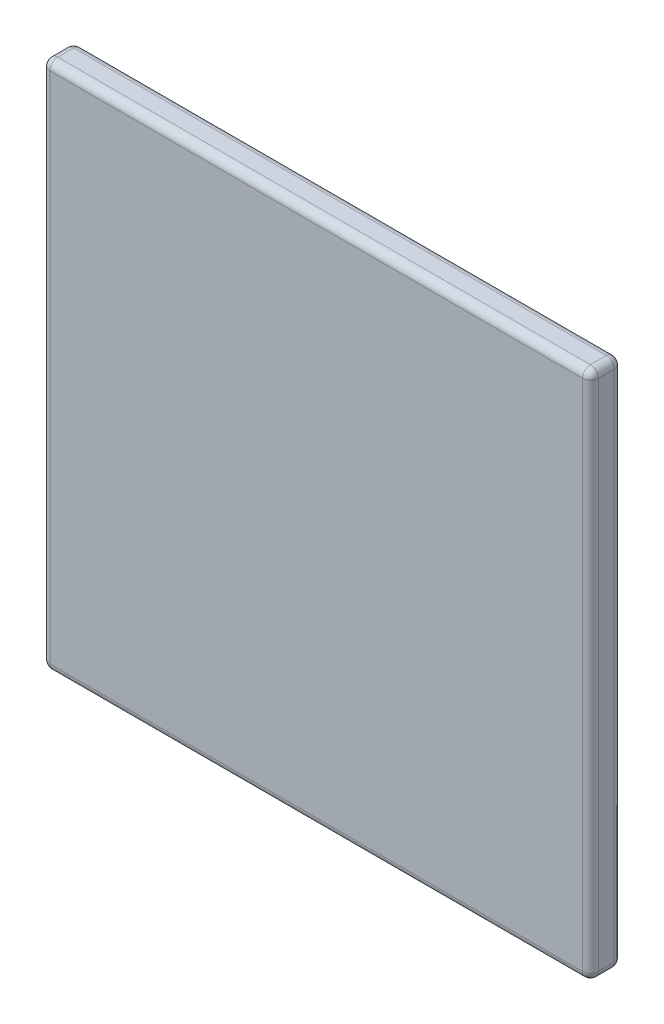
ISO-10303-21;
HEADER;
FILE_DESCRIPTION(('STEP AP214'),'2;1');
FILE_NAME('part.step','',(''),(''),'','','');
FILE_SCHEMA(('AUTOMOTIVE_DESIGN { 1 0 10303 214 1 1 1 1 }'));
ENDSEC;
DATA;
#1=APPLICATION_CONTEXT('core data for automotive mechanical design processes');
#2=APPLICATION_PROTOCOL_DEFINITION('international standard','automotive_design',2000,#1);
#3=PRODUCT_CONTEXT('',#1,'mechanical');
#4=PRODUCT('Part','Part','',(#3));
#5=PRODUCT_RELATED_PRODUCT_CATEGORY('part','',(#4));
#6=PRODUCT_DEFINITION_FORMATION('','',#4);
#7=PRODUCT_DEFINITION_CONTEXT('part definition',#1,'design');
#8=PRODUCT_DEFINITION('design','',#6,#7);
#9=PRODUCT_DEFINITION_SHAPE('','',#8);
#10=(LENGTH_UNIT() NAMED_UNIT(*) SI_UNIT(.MILLI.,.METRE.));
#11=(NAMED_UNIT(*) PLANE_ANGLE_UNIT() SI_UNIT($,.RADIAN.));
#12=(NAMED_UNIT(*) SI_UNIT($,.STERADIAN.) SOLID_ANGLE_UNIT());
#13=UNCERTAINTY_MEASURE_WITH_UNIT(LENGTH_MEASURE(1.E-05),#10,'distance_accuracy_value','');
#14=(GEOMETRIC_REPRESENTATION_CONTEXT(3) GLOBAL_UNCERTAINTY_ASSIGNED_CONTEXT((#13)) GLOBAL_UNIT_ASSIGNED_CONTEXT((#10,
#11,#12)) REPRESENTATION_CONTEXT('',''));
#15=CARTESIAN_POINT('',(0.,0.,0.));
#16=DIRECTION('',(0.,0.,1.));
#17=DIRECTION('',(1.,0.,0.));
#18=AXIS2_PLACEMENT_3D('',#15,#16,#17);
#19=CARTESIAN_POINT('',(17.35,-16.75,2.));
#20=DIRECTION('',(-1.,0.,0.));
#21=DIRECTION('',(0.,0.,1.));
#22=AXIS2_PLACEMENT_3D('',#19,#20,#21);
#23=PLANE('',#22);
#24=DIRECTION('',(0.,1.,0.));
#25=VECTOR('',#24,1.);
#26=CARTESIAN_POINT('',(17.35,-16.75,1.5));
#27=LINE('',#26,#25);
#28=CARTESIAN_POINT('',(17.35,16.25,1.5));
#29=VERTEX_POINT('',#28);
#30=CARTESIAN_POINT('',(17.35,-16.25,1.5));
#31=VERTEX_POINT('',#30);
#32=EDGE_CURVE('E41',#29,#31,#27,.F.);
#33=ORIENTED_EDGE('',*,*,#32,.T.);
#34=DIRECTION('',(0.,0.,-1.));
#35=VECTOR('',#34,1.);
#36=CARTESIAN_POINT('',(17.35,-16.25,2.));
#37=LINE('',#36,#35);
#38=CARTESIAN_POINT('',(17.35,-16.25,0.5));
#39=VERTEX_POINT('',#38);
#40=EDGE_CURVE('E11',#31,#39,#37,.T.);
#41=ORIENTED_EDGE('',*,*,#40,.T.);
#42=DIRECTION('',(0.,1.,0.));
#43=VECTOR('',#42,1.);
#44=CARTESIAN_POINT('',(17.35,16.75,0.5));
#45=LINE('',#44,#43);
#46=CARTESIAN_POINT('',(17.35,16.25,0.5));
#47=VERTEX_POINT('',#46);
#48=EDGE_CURVE('E193',#39,#47,#45,.T.);
#49=ORIENTED_EDGE('',*,*,#48,.T.);
#50=DIRECTION('',(0.,0.,-1.));
#51=VECTOR('',#50,1.);
#52=CARTESIAN_POINT('',(17.35,16.25,2.));
#53=LINE('',#52,#51);
#54=EDGE_CURVE('E52',#47,#29,#53,.F.);
#55=ORIENTED_EDGE('',*,*,#54,.T.);
#56=EDGE_LOOP('',(#33,#41,#49,#55));
#57=FACE_BOUND('',#56,.T.);
#58=ADVANCED_FACE('F32',(#57),#23,.F.);
#59=CARTESIAN_POINT('',(-17.35,16.75,2.));
#60=DIRECTION('',(0.,-1.,0.));
#61=DIRECTION('',(0.,0.,-1.));
#62=AXIS2_PLACEMENT_3D('',#59,#60,#61);
#63=PLANE('',#62);
#64=DIRECTION('',(0.,0.,-1.));
#65=VECTOR('',#64,1.);
#66=CARTESIAN_POINT('',(-16.85,16.75,2.));
#67=LINE('',#66,#65);
#68=CARTESIAN_POINT('',(-16.85,16.75,0.5));
#69=VERTEX_POINT('',#68);
#70=CARTESIAN_POINT('',(-16.85,16.75,1.5));
#71=VERTEX_POINT('',#70);
#72=EDGE_CURVE('E188',#69,#71,#67,.F.);
#73=ORIENTED_EDGE('',*,*,#72,.T.);
#74=DIRECTION('',(-1.,0.,0.));
#75=VECTOR('',#74,1.);
#76=CARTESIAN_POINT('',(-17.35,16.75,1.5));
#77=LINE('',#76,#75);
#78=CARTESIAN_POINT('',(16.85,16.75,1.5));
#79=VERTEX_POINT('',#78);
#80=EDGE_CURVE('E190',#71,#79,#77,.F.);
#81=ORIENTED_EDGE('',*,*,#80,.T.);
#82=DIRECTION('',(0.,0.,-1.));
#83=VECTOR('',#82,1.);
#84=CARTESIAN_POINT('',(16.85,16.75,2.));
#85=LINE('',#84,#83);
#86=CARTESIAN_POINT('',(16.85,16.75,0.5));
#87=VERTEX_POINT('',#86);
#88=EDGE_CURVE('E184',#79,#87,#85,.T.);
#89=ORIENTED_EDGE('',*,*,#88,.T.);
#90=DIRECTION('',(-1.,0.,0.));
#91=VECTOR('',#90,1.);
#92=CARTESIAN_POINT('',(-17.35,16.75,0.5));
#93=LINE('',#92,#91);
#94=EDGE_CURVE('E186',#87,#69,#93,.T.);
#95=ORIENTED_EDGE('',*,*,#94,.T.);
#96=EDGE_LOOP('',(#73,#81,#89,#95));
#97=FACE_BOUND('',#96,.T.);
#98=ADVANCED_FACE('F277',(#97),#63,.F.);
#99=CARTESIAN_POINT('',(-17.35,-16.75,2.));
#100=DIRECTION('',(1.,0.,0.));
#101=DIRECTION('',(0.,0.,-1.));
#102=AXIS2_PLACEMENT_3D('',#99,#100,#101);
#103=PLANE('',#102);
#104=DIRECTION('',(0.,0.,-1.));
#105=VECTOR('',#104,1.);
#106=CARTESIAN_POINT('',(-17.35,-16.25,2.));
#107=LINE('',#106,#105);
#108=CARTESIAN_POINT('',(-17.35,-16.25,0.5));
#109=VERTEX_POINT('',#108);
#110=CARTESIAN_POINT('',(-17.35,-16.25,1.5));
#111=VERTEX_POINT('',#110);
#112=EDGE_CURVE('E179',#109,#111,#107,.F.);
#113=ORIENTED_EDGE('',*,*,#112,.T.);
#114=DIRECTION('',(0.,-1.,0.));
#115=VECTOR('',#114,1.);
#116=CARTESIAN_POINT('',(-17.35,-16.75,1.5));
#117=LINE('',#116,#115);
#118=CARTESIAN_POINT('',(-17.35,16.25,1.5));
#119=VERTEX_POINT('',#118);
#120=EDGE_CURVE('E181',#111,#119,#117,.F.);
#121=ORIENTED_EDGE('',*,*,#120,.T.);
#122=DIRECTION('',(0.,0.,-1.));
#123=VECTOR('',#122,1.);
#124=CARTESIAN_POINT('',(-17.35,16.25,2.));
#125=LINE('',#124,#123);
#126=CARTESIAN_POINT('',(-17.35,16.25,0.5));
#127=VERTEX_POINT('',#126);
#128=EDGE_CURVE('E175',#119,#127,#125,.T.);
#129=ORIENTED_EDGE('',*,*,#128,.T.);
#130=DIRECTION('',(0.,-1.,0.));
#131=VECTOR('',#130,1.);
#132=CARTESIAN_POINT('',(-17.35,-16.75,0.5));
#133=LINE('',#132,#131);
#134=EDGE_CURVE('E177',#127,#109,#133,.T.);
#135=ORIENTED_EDGE('',*,*,#134,.T.);
#136=EDGE_LOOP('',(#113,#121,#129,#135));
#137=FACE_BOUND('',#136,.T.);
#138=ADVANCED_FACE('F268',(#137),#103,.F.);
#139=CARTESIAN_POINT('',(-17.35,-16.75,2.));
#140=DIRECTION('',(0.,1.,0.));
#141=DIRECTION('',(0.,0.,1.));
#142=AXIS2_PLACEMENT_3D('',#139,#140,#141);
#143=PLANE('',#142);
#144=DIRECTION('',(1.,0.,0.));
#145=VECTOR('',#144,1.);
#146=CARTESIAN_POINT('',(-17.35,-16.75,1.5));
#147=LINE('',#146,#145);
#148=CARTESIAN_POINT('',(16.85,-16.75,1.5));
#149=VERTEX_POINT('',#148);
#150=CARTESIAN_POINT('',(-16.85,-16.75,1.5));
#151=VERTEX_POINT('',#150);
#152=EDGE_CURVE('E128',#149,#151,#147,.F.);
#153=ORIENTED_EDGE('',*,*,#152,.T.);
#154=DIRECTION('',(0.,0.,-1.));
#155=VECTOR('',#154,1.);
#156=CARTESIAN_POINT('',(-16.85,-16.75,2.));
#157=LINE('',#156,#155);
#158=CARTESIAN_POINT('',(-16.85,-16.75,0.5));
#159=VERTEX_POINT('',#158);
#160=EDGE_CURVE('E164',#151,#159,#157,.T.);
#161=ORIENTED_EDGE('',*,*,#160,.T.);
#162=DIRECTION('',(1.,0.,0.));
#163=VECTOR('',#162,1.);
#164=CARTESIAN_POINT('',(17.35,-16.75,0.5));
#165=LINE('',#164,#163);
#166=CARTESIAN_POINT('',(16.85,-16.75,0.5));
#167=VERTEX_POINT('',#166);
#168=EDGE_CURVE('E157',#159,#167,#165,.T.);
#169=ORIENTED_EDGE('',*,*,#168,.T.);
#170=DIRECTION('',(0.,0.,-1.));
#171=VECTOR('',#170,1.);
#172=CARTESIAN_POINT('',(16.85,-16.75,2.));
#173=LINE('',#172,#171);
#174=EDGE_CURVE('E155',#167,#149,#173,.F.);
#175=ORIENTED_EDGE('',*,*,#174,.T.);
#176=EDGE_LOOP('',(#153,#161,#169,#175));
#177=FACE_BOUND('',#176,.T.);
#178=ADVANCED_FACE('F355',(#177),#143,.F.);
#179=CARTESIAN_POINT('',(0.,0.,2.));
#180=DIRECTION('',(0.,0.,-1.));
#181=DIRECTION('',(-1.,0.,0.));
#182=AXIS2_PLACEMENT_3D('',#179,#180,#181);
#183=PLANE('',#182);
#184=DIRECTION('',(0.,-1.,0.));
#185=VECTOR('',#184,1.);
#186=CARTESIAN_POINT('',(-16.85,0.,2.));
#187=LINE('',#186,#185);
#188=CARTESIAN_POINT('',(-16.85,16.25,2.));
#189=VERTEX_POINT('',#188);
#190=CARTESIAN_POINT('',(-16.85,-16.25,2.));
#191=VERTEX_POINT('',#190);
#192=EDGE_CURVE('E153',#189,#191,#187,.T.);
#193=ORIENTED_EDGE('',*,*,#192,.T.);
#194=DIRECTION('',(1.,0.,0.));
#195=VECTOR('',#194,1.);
#196=CARTESIAN_POINT('',(0.,-16.25,2.));
#197=LINE('',#196,#195);
#198=CARTESIAN_POINT('',(16.85,-16.25,2.));
#199=VERTEX_POINT('',#198);
#200=EDGE_CURVE('E126',#191,#199,#197,.T.);
#201=ORIENTED_EDGE('',*,*,#200,.T.);
#202=DIRECTION('',(0.,1.,0.));
#203=VECTOR('',#202,1.);
#204=CARTESIAN_POINT('',(16.85,0.,2.));
#205=LINE('',#204,#203);
#206=CARTESIAN_POINT('',(16.85,16.25,2.));
#207=VERTEX_POINT('',#206);
#208=EDGE_CURVE('E143',#199,#207,#205,.T.);
#209=ORIENTED_EDGE('',*,*,#208,.T.);
#210=DIRECTION('',(-1.,0.,0.));
#211=VECTOR('',#210,1.);
#212=CARTESIAN_POINT('',(0.,16.25,2.));
#213=LINE('',#212,#211);
#214=EDGE_CURVE('E149',#207,#189,#213,.T.);
#215=ORIENTED_EDGE('',*,*,#214,.T.);
#216=EDGE_LOOP('',(#193,#201,#209,#215));
#217=FACE_BOUND('',#216,.T.);
#218=ADVANCED_FACE('F151',(#217),#183,.F.);
#219=CARTESIAN_POINT('',(0.,0.,0.));
#220=DIRECTION('',(0.,0.,-1.));
#221=DIRECTION('',(-1.,0.,0.));
#222=AXIS2_PLACEMENT_3D('',#219,#220,#221);
#223=PLANE('',#222);
#224=DIRECTION('',(0.,1.,0.));
#225=VECTOR('',#224,1.);
#226=CARTESIAN_POINT('',(16.85,-16.75,0.));
#227=LINE('',#226,#225);
#228=CARTESIAN_POINT('',(16.85,16.25,0.));
#229=VERTEX_POINT('',#228);
#230=CARTESIAN_POINT('',(16.85,-16.25,0.));
#231=VERTEX_POINT('',#230);
#232=EDGE_CURVE('E166',#229,#231,#227,.F.);
#233=ORIENTED_EDGE('',*,*,#232,.T.);
#234=DIRECTION('',(1.,0.,0.));
#235=VECTOR('',#234,1.);
#236=CARTESIAN_POINT('',(-17.35,-16.25,0.));
#237=LINE('',#236,#235);
#238=CARTESIAN_POINT('',(-16.85,-16.25,0.));
#239=VERTEX_POINT('',#238);
#240=EDGE_CURVE('E172',#231,#239,#237,.F.);
#241=ORIENTED_EDGE('',*,*,#240,.T.);
#242=DIRECTION('',(0.,-1.,0.));
#243=VECTOR('',#242,1.);
#244=CARTESIAN_POINT('',(-16.85,16.75,0.));
#245=LINE('',#244,#243);
#246=CARTESIAN_POINT('',(-16.85,16.25,0.));
#247=VERTEX_POINT('',#246);
#248=EDGE_CURVE('E170',#239,#247,#245,.F.);
#249=ORIENTED_EDGE('',*,*,#248,.T.);
#250=DIRECTION('',(-1.,0.,0.));
#251=VECTOR('',#250,1.);
#252=CARTESIAN_POINT('',(17.35,16.25,0.));
#253=LINE('',#252,#251);
#254=EDGE_CURVE('E168',#247,#229,#253,.F.);
#255=ORIENTED_EDGE('',*,*,#254,.T.);
#256=EDGE_LOOP('',(#233,#241,#249,#255));
#257=FACE_BOUND('',#256,.T.);
#258=ADVANCED_FACE('F295',(#257),#223,.T.);
#259=CARTESIAN_POINT('',(-17.35,16.25,0.5));
#260=DIRECTION('',(1.,0.,0.));
#261=DIRECTION('',(0.,0.,-1.));
#262=AXIS2_PLACEMENT_3D('',#259,#260,#261);
#263=CYLINDRICAL_SURFACE('',#262,0.5);
#264=CARTESIAN_POINT('',(-16.85,16.25,0.5));
#265=DIRECTION('',(-1.,0.,0.));
#266=DIRECTION('',(0.,0.,1.));
#267=AXIS2_PLACEMENT_3D('',#264,#265,#266);
#268=CIRCLE('',#267,0.5);
#269=EDGE_CURVE('E36',#69,#247,#268,.T.);
#270=ORIENTED_EDGE('',*,*,#269,.F.);
#271=ORIENTED_EDGE('',*,*,#94,.F.);
#272=CARTESIAN_POINT('',(16.85,16.25,0.5));
#273=DIRECTION('',(1.,0.,0.));
#274=DIRECTION('',(0.,0.,-1.));
#275=AXIS2_PLACEMENT_3D('',#272,#273,#274);
#276=CIRCLE('',#275,0.5);
#277=EDGE_CURVE('E245',#229,#87,#276,.T.);
#278=ORIENTED_EDGE('',*,*,#277,.F.);
#279=ORIENTED_EDGE('',*,*,#254,.F.);
#280=EDGE_LOOP('',(#270,#271,#278,#279));
#281=FACE_BOUND('',#280,.T.);
#282=ADVANCED_FACE('F34',(#281),#263,.T.);
#283=CARTESIAN_POINT('',(-16.85,16.25,0.5));
#284=DIRECTION('',(0.,0.,1.));
#285=DIRECTION('',(1.,0.,0.));
#286=AXIS2_PLACEMENT_3D('',#283,#284,#285);
#287=SPHERICAL_SURFACE('',#286,0.5);
#288=CARTESIAN_POINT('',(-16.85,16.25,0.5));
#289=DIRECTION('',(0.,0.,-1.));
#290=DIRECTION('',(-1.,0.,0.));
#291=AXIS2_PLACEMENT_3D('',#288,#289,#290);
#292=CIRCLE('',#291,0.5);
#293=EDGE_CURVE('E240',#69,#127,#292,.F.);
#294=ORIENTED_EDGE('',*,*,#293,.F.);
#295=ORIENTED_EDGE('',*,*,#269,.T.);
#296=CARTESIAN_POINT('',(-16.85,16.25,0.5));
#297=DIRECTION('',(0.,1.,0.));
#298=DIRECTION('',(0.,0.,1.));
#299=AXIS2_PLACEMENT_3D('',#296,#297,#298);
#300=CIRCLE('',#299,0.5);
#301=EDGE_CURVE('E243',#127,#247,#300,.F.);
#302=ORIENTED_EDGE('',*,*,#301,.F.);
#303=EDGE_LOOP('',(#294,#295,#302));
#304=FACE_BOUND('',#303,.T.);
#305=ADVANCED_FACE('F256',(#304),#287,.T.);
#306=CARTESIAN_POINT('',(16.85,16.25,0.5));
#307=DIRECTION('',(0.,0.,1.));
#308=DIRECTION('',(1.,0.,0.));
#309=AXIS2_PLACEMENT_3D('',#306,#307,#308);
#310=SPHERICAL_SURFACE('',#309,0.5);
#311=CARTESIAN_POINT('',(16.85,16.25,0.5));
#312=DIRECTION('',(0.,1.,0.));
#313=DIRECTION('',(0.,0.,1.));
#314=AXIS2_PLACEMENT_3D('',#311,#312,#313);
#315=CIRCLE('',#314,0.5);
#316=EDGE_CURVE('E234',#229,#47,#315,.F.);
#317=ORIENTED_EDGE('',*,*,#316,.F.);
#318=ORIENTED_EDGE('',*,*,#277,.T.);
#319=CARTESIAN_POINT('',(16.85,16.25,0.5));
#320=DIRECTION('',(0.,0.,-1.));
#321=DIRECTION('',(-1.,0.,0.));
#322=AXIS2_PLACEMENT_3D('',#319,#320,#321);
#323=CIRCLE('',#322,0.5);
#324=EDGE_CURVE('E237',#47,#87,#323,.F.);
#325=ORIENTED_EDGE('',*,*,#324,.F.);
#326=EDGE_LOOP('',(#317,#318,#325));
#327=FACE_BOUND('',#326,.T.);
#328=ADVANCED_FACE('F288',(#327),#310,.T.);
#329=CARTESIAN_POINT('',(-16.85,-16.75,0.5));
#330=DIRECTION('',(0.,1.,0.));
#331=DIRECTION('',(0.,0.,1.));
#332=AXIS2_PLACEMENT_3D('',#329,#330,#331);
#333=CYLINDRICAL_SURFACE('',#332,0.5);
#334=ORIENTED_EDGE('',*,*,#301,.T.);
#335=ORIENTED_EDGE('',*,*,#248,.F.);
#336=CARTESIAN_POINT('',(-16.85,-16.25,0.5));
#337=DIRECTION('',(0.,-1.,0.));
#338=DIRECTION('',(0.,0.,-1.));
#339=AXIS2_PLACEMENT_3D('',#336,#337,#338);
#340=CIRCLE('',#339,0.5);
#341=EDGE_CURVE('E229',#109,#239,#340,.T.);
#342=ORIENTED_EDGE('',*,*,#341,.F.);
#343=ORIENTED_EDGE('',*,*,#134,.F.);
#344=EDGE_LOOP('',(#334,#335,#342,#343));
#345=FACE_BOUND('',#344,.T.);
#346=ADVANCED_FACE('F264',(#345),#333,.T.);
#347=CARTESIAN_POINT('',(-16.85,16.25,2.));
#348=DIRECTION('',(0.,0.,-1.));
#349=DIRECTION('',(-1.,0.,0.));
#350=AXIS2_PLACEMENT_3D('',#347,#348,#349);
#351=CYLINDRICAL_SURFACE('',#350,0.5);
#352=ORIENTED_EDGE('',*,*,#293,.T.);
#353=ORIENTED_EDGE('',*,*,#128,.F.);
#354=CARTESIAN_POINT('',(-16.85,16.25,1.5));
#355=DIRECTION('',(0.,0.,1.));
#356=DIRECTION('',(1.,0.,0.));
#357=AXIS2_PLACEMENT_3D('',#354,#355,#356);
#358=CIRCLE('',#357,0.5);
#359=EDGE_CURVE('E226',#71,#119,#358,.T.);
#360=ORIENTED_EDGE('',*,*,#359,.F.);
#361=ORIENTED_EDGE('',*,*,#72,.F.);
#362=EDGE_LOOP('',(#352,#353,#360,#361));
#363=FACE_BOUND('',#362,.T.);
#364=ADVANCED_FACE('F274',(#363),#351,.T.);
#365=CARTESIAN_POINT('',(0.,16.25,1.5));
#366=DIRECTION('',(-1.,0.,0.));
#367=DIRECTION('',(0.,0.,1.));
#368=AXIS2_PLACEMENT_3D('',#365,#366,#367);
#369=CYLINDRICAL_SURFACE('',#368,0.5);
#370=CARTESIAN_POINT('',(16.85,16.25,1.5));
#371=DIRECTION('',(1.,0.,0.));
#372=DIRECTION('',(0.,0.,-1.));
#373=AXIS2_PLACEMENT_3D('',#370,#371,#372);
#374=CIRCLE('',#373,0.5);
#375=EDGE_CURVE('E220',#79,#207,#374,.T.);
#376=ORIENTED_EDGE('',*,*,#375,.F.);
#377=ORIENTED_EDGE('',*,*,#80,.F.);
#378=CARTESIAN_POINT('',(-16.85,16.25,1.5));
#379=DIRECTION('',(-1.,0.,0.));
#380=DIRECTION('',(0.,0.,1.));
#381=AXIS2_PLACEMENT_3D('',#378,#379,#380);
#382=CIRCLE('',#381,0.5);
#383=EDGE_CURVE('E223',#189,#71,#382,.T.);
#384=ORIENTED_EDGE('',*,*,#383,.F.);
#385=ORIENTED_EDGE('',*,*,#214,.F.);
#386=EDGE_LOOP('',(#376,#377,#384,#385));
#387=FACE_BOUND('',#386,.T.);
#388=ADVANCED_FACE('F281',(#387),#369,.T.);
#389=CARTESIAN_POINT('',(16.85,16.25,2.));
#390=DIRECTION('',(0.,0.,-1.));
#391=DIRECTION('',(-1.,0.,0.));
#392=AXIS2_PLACEMENT_3D('',#389,#390,#391);
#393=CYLINDRICAL_SURFACE('',#392,0.5);
#394=ORIENTED_EDGE('',*,*,#324,.T.);
#395=ORIENTED_EDGE('',*,*,#88,.F.);
#396=CARTESIAN_POINT('',(16.85,16.25,1.5));
#397=DIRECTION('',(0.,0.,1.));
#398=DIRECTION('',(1.,0.,0.));
#399=AXIS2_PLACEMENT_3D('',#396,#397,#398);
#400=CIRCLE('',#399,0.5);
#401=EDGE_CURVE('E218',#29,#79,#400,.T.);
#402=ORIENTED_EDGE('',*,*,#401,.F.);
#403=ORIENTED_EDGE('',*,*,#54,.F.);
#404=EDGE_LOOP('',(#394,#395,#402,#403));
#405=FACE_BOUND('',#404,.T.);
#406=ADVANCED_FACE('F286',(#405),#393,.T.);
#407=CARTESIAN_POINT('',(16.85,-16.75,0.5));
#408=DIRECTION('',(0.,-1.,0.));
#409=DIRECTION('',(0.,0.,-1.));
#410=AXIS2_PLACEMENT_3D('',#407,#408,#409);
#411=CYLINDRICAL_SURFACE('',#410,0.5);
#412=ORIENTED_EDGE('',*,*,#316,.T.);
#413=ORIENTED_EDGE('',*,*,#48,.F.);
#414=CARTESIAN_POINT('',(16.85,-16.25,0.5));
#415=DIRECTION('',(0.,-1.,0.));
#416=DIRECTION('',(0.,0.,-1.));
#417=AXIS2_PLACEMENT_3D('',#414,#415,#416);
#418=CIRCLE('',#417,0.5);
#419=EDGE_CURVE('E215',#231,#39,#418,.T.);
#420=ORIENTED_EDGE('',*,*,#419,.F.);
#421=ORIENTED_EDGE('',*,*,#232,.F.);
#422=EDGE_LOOP('',(#412,#413,#420,#421));
#423=FACE_BOUND('',#422,.T.);
#424=ADVANCED_FACE('F292',(#423),#411,.T.);
#425=CARTESIAN_POINT('',(-17.35,-16.25,0.5));
#426=DIRECTION('',(-1.,0.,0.));
#427=DIRECTION('',(0.,0.,1.));
#428=AXIS2_PLACEMENT_3D('',#425,#426,#427);
#429=CYLINDRICAL_SURFACE('',#428,0.5);
#430=CARTESIAN_POINT('',(-16.85,-16.25,0.5));
#431=DIRECTION('',(-1.,0.,0.));
#432=DIRECTION('',(0.,0.,1.));
#433=AXIS2_PLACEMENT_3D('',#430,#431,#432);
#434=CIRCLE('',#433,0.5);
#435=EDGE_CURVE('E231',#239,#159,#434,.T.);
#436=ORIENTED_EDGE('',*,*,#435,.F.);
#437=ORIENTED_EDGE('',*,*,#240,.F.);
#438=CARTESIAN_POINT('',(16.85,-16.25,0.5));
#439=DIRECTION('',(1.,0.,0.));
#440=DIRECTION('',(0.,0.,-1.));
#441=AXIS2_PLACEMENT_3D('',#438,#439,#440);
#442=CIRCLE('',#441,0.5);
#443=EDGE_CURVE('E212',#167,#231,#442,.T.);
#444=ORIENTED_EDGE('',*,*,#443,.F.);
#445=ORIENTED_EDGE('',*,*,#168,.F.);
#446=EDGE_LOOP('',(#436,#437,#444,#445));
#447=FACE_BOUND('',#446,.T.);
#448=ADVANCED_FACE('F299',(#447),#429,.T.);
#449=CARTESIAN_POINT('',(-16.85,-16.25,0.5));
#450=DIRECTION('',(0.,0.,1.));
#451=DIRECTION('',(1.,0.,0.));
#452=AXIS2_PLACEMENT_3D('',#449,#450,#451);
#453=SPHERICAL_SURFACE('',#452,0.5);
#454=ORIENTED_EDGE('',*,*,#341,.T.);
#455=ORIENTED_EDGE('',*,*,#435,.T.);
#456=CARTESIAN_POINT('',(-16.85,-16.25,0.5));
#457=DIRECTION('',(0.,0.,-1.));
#458=DIRECTION('',(-1.,0.,0.));
#459=AXIS2_PLACEMENT_3D('',#456,#457,#458);
#460=CIRCLE('',#459,0.5);
#461=EDGE_CURVE('E209',#109,#159,#460,.F.);
#462=ORIENTED_EDGE('',*,*,#461,.F.);
#463=EDGE_LOOP('',(#454,#455,#462));
#464=FACE_BOUND('',#463,.T.);
#465=ADVANCED_FACE('F303',(#464),#453,.T.);
#466=CARTESIAN_POINT('',(-16.85,16.25,1.5));
#467=DIRECTION('',(0.,0.,1.));
#468=DIRECTION('',(1.,0.,0.));
#469=AXIS2_PLACEMENT_3D('',#466,#467,#468);
#470=SPHERICAL_SURFACE('',#469,0.5);
#471=ORIENTED_EDGE('',*,*,#383,.T.);
#472=ORIENTED_EDGE('',*,*,#359,.T.);
#473=CARTESIAN_POINT('',(-16.85,16.25,1.5));
#474=DIRECTION('',(0.,1.,0.));
#475=DIRECTION('',(0.,0.,1.));
#476=AXIS2_PLACEMENT_3D('',#473,#474,#475);
#477=CIRCLE('',#476,0.5);
#478=EDGE_CURVE('E207',#189,#119,#477,.F.);
#479=ORIENTED_EDGE('',*,*,#478,.F.);
#480=EDGE_LOOP('',(#471,#472,#479));
#481=FACE_BOUND('',#480,.T.);
#482=ADVANCED_FACE('F314',(#481),#470,.T.);
#483=CARTESIAN_POINT('',(16.85,16.25,1.5));
#484=DIRECTION('',(0.,0.,1.));
#485=DIRECTION('',(1.,0.,0.));
#486=AXIS2_PLACEMENT_3D('',#483,#484,#485);
#487=SPHERICAL_SURFACE('',#486,0.5);
#488=ORIENTED_EDGE('',*,*,#401,.T.);
#489=ORIENTED_EDGE('',*,*,#375,.T.);
#490=CARTESIAN_POINT('',(16.85,16.25,1.5));
#491=DIRECTION('',(0.,1.,0.));
#492=DIRECTION('',(0.,0.,1.));
#493=AXIS2_PLACEMENT_3D('',#490,#491,#492);
#494=CIRCLE('',#493,0.5);
#495=EDGE_CURVE('E146',#29,#207,#494,.F.);
#496=ORIENTED_EDGE('',*,*,#495,.F.);
#497=EDGE_LOOP('',(#488,#489,#496));
#498=FACE_BOUND('',#497,.T.);
#499=ADVANCED_FACE('F316',(#498),#487,.T.);
#500=CARTESIAN_POINT('',(16.85,-16.25,0.5));
#501=DIRECTION('',(0.,0.,1.));
#502=DIRECTION('',(1.,0.,0.));
#503=AXIS2_PLACEMENT_3D('',#500,#501,#502);
#504=SPHERICAL_SURFACE('',#503,0.5);
#505=ORIENTED_EDGE('',*,*,#443,.T.);
#506=ORIENTED_EDGE('',*,*,#419,.T.);
#507=CARTESIAN_POINT('',(16.85,-16.25,0.5));
#508=DIRECTION('',(0.,0.,-1.));
#509=DIRECTION('',(-1.,0.,0.));
#510=AXIS2_PLACEMENT_3D('',#507,#508,#509);
#511=CIRCLE('',#510,0.5);
#512=EDGE_CURVE('E204',#167,#39,#511,.F.);
#513=ORIENTED_EDGE('',*,*,#512,.F.);
#514=EDGE_LOOP('',(#505,#506,#513));
#515=FACE_BOUND('',#514,.T.);
#516=ADVANCED_FACE('F322',(#515),#504,.T.);
#517=CARTESIAN_POINT('',(-16.85,-16.25,2.));
#518=DIRECTION('',(0.,0.,-1.));
#519=DIRECTION('',(-1.,0.,0.));
#520=AXIS2_PLACEMENT_3D('',#517,#518,#519);
#521=CYLINDRICAL_SURFACE('',#520,0.5);
#522=ORIENTED_EDGE('',*,*,#461,.T.);
#523=ORIENTED_EDGE('',*,*,#160,.F.);
#524=CARTESIAN_POINT('',(-16.85,-16.25,1.5));
#525=DIRECTION('',(0.,0.,1.));
#526=DIRECTION('',(1.,0.,0.));
#527=AXIS2_PLACEMENT_3D('',#524,#525,#526);
#528=CIRCLE('',#527,0.5);
#529=EDGE_CURVE('E201',#111,#151,#528,.T.);
#530=ORIENTED_EDGE('',*,*,#529,.F.);
#531=ORIENTED_EDGE('',*,*,#112,.F.);
#532=EDGE_LOOP('',(#522,#523,#530,#531));
#533=FACE_BOUND('',#532,.T.);
#534=ADVANCED_FACE('F306',(#533),#521,.T.);
#535=CARTESIAN_POINT('',(-16.85,0.,1.5));
#536=DIRECTION('',(0.,-1.,0.));
#537=DIRECTION('',(0.,0.,-1.));
#538=AXIS2_PLACEMENT_3D('',#535,#536,#537);
#539=CYLINDRICAL_SURFACE('',#538,0.5);
#540=ORIENTED_EDGE('',*,*,#478,.T.);
#541=ORIENTED_EDGE('',*,*,#120,.F.);
#542=CARTESIAN_POINT('',(-16.85,-16.25,1.5));
#543=DIRECTION('',(0.,-1.,0.));
#544=DIRECTION('',(0.,0.,-1.));
#545=AXIS2_PLACEMENT_3D('',#542,#543,#544);
#546=CIRCLE('',#545,0.5);
#547=EDGE_CURVE('E140',#191,#111,#546,.T.);
#548=ORIENTED_EDGE('',*,*,#547,.F.);
#549=ORIENTED_EDGE('',*,*,#192,.F.);
#550=EDGE_LOOP('',(#540,#541,#548,#549));
#551=FACE_BOUND('',#550,.T.);
#552=ADVANCED_FACE('F312',(#551),#539,.T.);
#553=CARTESIAN_POINT('',(16.85,0.,1.5));
#554=DIRECTION('',(0.,1.,0.));
#555=DIRECTION('',(0.,0.,1.));
#556=AXIS2_PLACEMENT_3D('',#553,#554,#555);
#557=CYLINDRICAL_SURFACE('',#556,0.5);
#558=ORIENTED_EDGE('',*,*,#495,.T.);
#559=ORIENTED_EDGE('',*,*,#208,.F.);
#560=CARTESIAN_POINT('',(16.85,-16.25,1.5));
#561=DIRECTION('',(0.,-1.,0.));
#562=DIRECTION('',(0.,0.,-1.));
#563=AXIS2_PLACEMENT_3D('',#560,#561,#562);
#564=CIRCLE('',#563,0.5);
#565=EDGE_CURVE('E134',#31,#199,#564,.T.);
#566=ORIENTED_EDGE('',*,*,#565,.F.);
#567=ORIENTED_EDGE('',*,*,#32,.F.);
#568=EDGE_LOOP('',(#558,#559,#566,#567));
#569=FACE_BOUND('',#568,.T.);
#570=ADVANCED_FACE('F144',(#569),#557,.T.);
#571=CARTESIAN_POINT('',(16.85,-16.25,2.));
#572=DIRECTION('',(0.,0.,-1.));
#573=DIRECTION('',(-1.,0.,0.));
#574=AXIS2_PLACEMENT_3D('',#571,#572,#573);
#575=CYLINDRICAL_SURFACE('',#574,0.5);
#576=ORIENTED_EDGE('',*,*,#512,.T.);
#577=ORIENTED_EDGE('',*,*,#40,.F.);
#578=CARTESIAN_POINT('',(16.85,-16.25,1.5));
#579=DIRECTION('',(0.,0.,1.));
#580=DIRECTION('',(1.,0.,0.));
#581=AXIS2_PLACEMENT_3D('',#578,#579,#580);
#582=CIRCLE('',#581,0.5);
#583=EDGE_CURVE('E138',#149,#31,#582,.T.);
#584=ORIENTED_EDGE('',*,*,#583,.F.);
#585=ORIENTED_EDGE('',*,*,#174,.F.);
#586=EDGE_LOOP('',(#576,#577,#584,#585));
#587=FACE_BOUND('',#586,.T.);
#588=ADVANCED_FACE('F339',(#587),#575,.T.);
#589=CARTESIAN_POINT('',(-16.85,-16.25,1.5));
#590=DIRECTION('',(0.,0.,1.));
#591=DIRECTION('',(1.,0.,0.));
#592=AXIS2_PLACEMENT_3D('',#589,#590,#591);
#593=SPHERICAL_SURFACE('',#592,0.5);
#594=ORIENTED_EDGE('',*,*,#547,.T.);
#595=ORIENTED_EDGE('',*,*,#529,.T.);
#596=CARTESIAN_POINT('',(-16.85,-16.25,1.5));
#597=DIRECTION('',(-1.,0.,0.));
#598=DIRECTION('',(0.,0.,1.));
#599=AXIS2_PLACEMENT_3D('',#596,#597,#598);
#600=CIRCLE('',#599,0.5);
#601=EDGE_CURVE('E131',#191,#151,#600,.F.);
#602=ORIENTED_EDGE('',*,*,#601,.F.);
#603=EDGE_LOOP('',(#594,#595,#602));
#604=FACE_BOUND('',#603,.T.);
#605=ADVANCED_FACE('F310',(#604),#593,.T.);
#606=CARTESIAN_POINT('',(16.85,-16.25,1.5));
#607=DIRECTION('',(0.,0.,1.));
#608=DIRECTION('',(1.,0.,0.));
#609=AXIS2_PLACEMENT_3D('',#606,#607,#608);
#610=SPHERICAL_SURFACE('',#609,0.5);
#611=ORIENTED_EDGE('',*,*,#583,.T.);
#612=ORIENTED_EDGE('',*,*,#565,.T.);
#613=CARTESIAN_POINT('',(16.85,-16.25,1.5));
#614=DIRECTION('',(1.,0.,0.));
#615=DIRECTION('',(0.,0.,-1.));
#616=AXIS2_PLACEMENT_3D('',#613,#614,#615);
#617=CIRCLE('',#616,0.5);
#618=EDGE_CURVE('E122',#149,#199,#617,.F.);
#619=ORIENTED_EDGE('',*,*,#618,.F.);
#620=EDGE_LOOP('',(#611,#612,#619));
#621=FACE_BOUND('',#620,.T.);
#622=ADVANCED_FACE('F136',(#621),#610,.T.);
#623=CARTESIAN_POINT('',(0.,-16.25,1.5));
#624=DIRECTION('',(1.,0.,0.));
#625=DIRECTION('',(0.,0.,-1.));
#626=AXIS2_PLACEMENT_3D('',#623,#624,#625);
#627=CYLINDRICAL_SURFACE('',#626,0.5);
#628=ORIENTED_EDGE('',*,*,#601,.T.);
#629=ORIENTED_EDGE('',*,*,#152,.F.);
#630=ORIENTED_EDGE('',*,*,#618,.T.);
#631=ORIENTED_EDGE('',*,*,#200,.F.);
#632=EDGE_LOOP('',(#628,#629,#630,#631));
#633=FACE_BOUND('',#632,.T.);
#634=ADVANCED_FACE('F124',(#633),#627,.T.);
#635=CLOSED_SHELL('',(#58,#98,#138,#178,#218,#258,#282,#305,#328,#346,#364,#388,#406,#424,#448,
#465,#482,#499,#516,#534,#552,#570,#588,#605,#622,#634));
#636=MANIFOLD_SOLID_BREP('B2',#635);
#637=ADVANCED_BREP_SHAPE_REPRESENTATION('',(#18,#636),#14);
#638=SHAPE_DEFINITION_REPRESENTATION(#9,#637);
ENDSEC;
END-ISO-10303-21;
